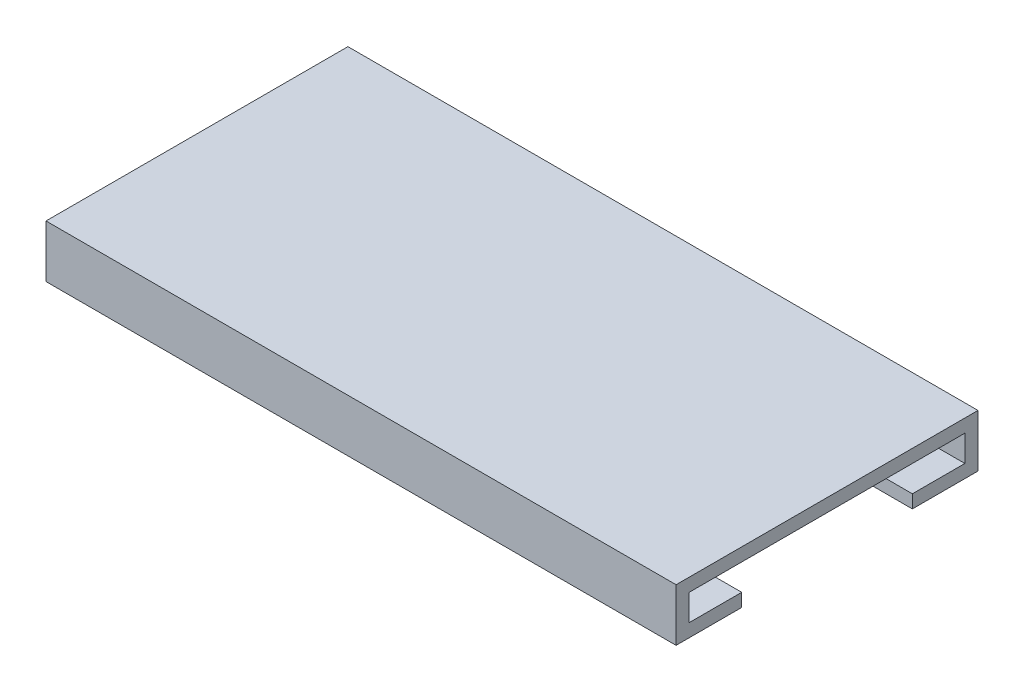
ISO-10303-21;
HEADER;
FILE_DESCRIPTION(('STEP AP214'),'2;1');
FILE_NAME('part.step','',(''),(''),'','','');
FILE_SCHEMA(('AUTOMOTIVE_DESIGN { 1 0 10303 214 1 1 1 1 }'));
ENDSEC;
DATA;
#1=APPLICATION_CONTEXT('core data for automotive mechanical design processes');
#2=APPLICATION_PROTOCOL_DEFINITION('international standard','automotive_design',2000,#1);
#3=PRODUCT_CONTEXT('',#1,'mechanical');
#4=PRODUCT('Part','Part','',(#3));
#5=PRODUCT_RELATED_PRODUCT_CATEGORY('part','',(#4));
#6=PRODUCT_DEFINITION_FORMATION('','',#4);
#7=PRODUCT_DEFINITION_CONTEXT('part definition',#1,'design');
#8=PRODUCT_DEFINITION('design','',#6,#7);
#9=PRODUCT_DEFINITION_SHAPE('','',#8);
#10=(LENGTH_UNIT() NAMED_UNIT(*) SI_UNIT(.MILLI.,.METRE.));
#11=(NAMED_UNIT(*) PLANE_ANGLE_UNIT() SI_UNIT($,.RADIAN.));
#12=(NAMED_UNIT(*) SI_UNIT($,.STERADIAN.) SOLID_ANGLE_UNIT());
#13=UNCERTAINTY_MEASURE_WITH_UNIT(LENGTH_MEASURE(1.E-05),#10,'distance_accuracy_value','');
#14=(GEOMETRIC_REPRESENTATION_CONTEXT(3) GLOBAL_UNCERTAINTY_ASSIGNED_CONTEXT((#13)) GLOBAL_UNIT_ASSIGNED_CONTEXT((#10,
#11,#12)) REPRESENTATION_CONTEXT('',''));
#15=CARTESIAN_POINT('',(0.,0.,0.));
#16=DIRECTION('',(0.,0.,1.));
#17=DIRECTION('',(1.,0.,0.));
#18=AXIS2_PLACEMENT_3D('',#15,#16,#17);
#19=CARTESIAN_POINT('',(76.2,-3.175,-18.25625));
#20=DIRECTION('',(0.,0.,1.));
#21=DIRECTION('',(1.,0.,0.));
#22=AXIS2_PLACEMENT_3D('',#19,#20,#21);
#23=PLANE('',#22);
#24=DIRECTION('',(0.,1.,0.));
#25=VECTOR('',#24,1.);
#26=CARTESIAN_POINT('',(0.,-3.175,-18.25625));
#27=LINE('',#26,#25);
#28=CARTESIAN_POINT('',(0.,-3.175,-18.25625));
#29=VERTEX_POINT('',#28);
#30=CARTESIAN_POINT('',(0.,3.175,-18.25625));
#31=VERTEX_POINT('',#30);
#32=EDGE_CURVE('E162',#29,#31,#27,.T.);
#33=ORIENTED_EDGE('',*,*,#32,.T.);
#34=DIRECTION('',(-1.,0.,0.));
#35=VECTOR('',#34,1.);
#36=CARTESIAN_POINT('',(76.2,3.175,-18.25625));
#37=LINE('',#36,#35);
#38=CARTESIAN_POINT('',(76.2,3.175,-18.25625));
#39=VERTEX_POINT('',#38);
#40=EDGE_CURVE('E11',#39,#31,#37,.T.);
#41=ORIENTED_EDGE('',*,*,#40,.F.);
#42=DIRECTION('',(0.,1.,0.));
#43=VECTOR('',#42,1.);
#44=CARTESIAN_POINT('',(76.2,-3.175,-18.25625));
#45=LINE('',#44,#43);
#46=CARTESIAN_POINT('',(76.2,-3.175,-18.25625));
#47=VERTEX_POINT('',#46);
#48=EDGE_CURVE('E184',#47,#39,#45,.T.);
#49=ORIENTED_EDGE('',*,*,#48,.F.);
#50=DIRECTION('',(-1.,0.,0.));
#51=VECTOR('',#50,1.);
#52=CARTESIAN_POINT('',(76.2,-3.175,-18.25625));
#53=LINE('',#52,#51);
#54=EDGE_CURVE('E158',#47,#29,#53,.T.);
#55=ORIENTED_EDGE('',*,*,#54,.T.);
#56=EDGE_LOOP('',(#33,#41,#49,#55));
#57=FACE_BOUND('',#56,.T.);
#58=ADVANCED_FACE('F42',(#57),#23,.F.);
#59=CARTESIAN_POINT('',(76.2,3.175,18.25625));
#60=DIRECTION('',(0.,-1.,0.));
#61=DIRECTION('',(0.,0.,-1.));
#62=AXIS2_PLACEMENT_3D('',#59,#60,#61);
#63=PLANE('',#62);
#64=DIRECTION('',(0.,0.,1.));
#65=VECTOR('',#64,1.);
#66=CARTESIAN_POINT('',(0.,3.175,18.25625));
#67=LINE('',#66,#65);
#68=CARTESIAN_POINT('',(0.,3.175,18.25625));
#69=VERTEX_POINT('',#68);
#70=EDGE_CURVE('E165',#31,#69,#67,.T.);
#71=ORIENTED_EDGE('',*,*,#70,.T.);
#72=DIRECTION('',(-1.,0.,0.));
#73=VECTOR('',#72,1.);
#74=CARTESIAN_POINT('',(76.2,3.175,18.25625));
#75=LINE('',#74,#73);
#76=CARTESIAN_POINT('',(76.2,3.175,18.25625));
#77=VERTEX_POINT('',#76);
#78=EDGE_CURVE('E50',#77,#69,#75,.T.);
#79=ORIENTED_EDGE('',*,*,#78,.F.);
#80=DIRECTION('',(0.,0.,1.));
#81=VECTOR('',#80,1.);
#82=CARTESIAN_POINT('',(76.2,3.175,18.25625));
#83=LINE('',#82,#81);
#84=EDGE_CURVE('E113',#39,#77,#83,.T.);
#85=ORIENTED_EDGE('',*,*,#84,.F.);
#86=ORIENTED_EDGE('',*,*,#40,.T.);
#87=EDGE_LOOP('',(#71,#79,#85,#86));
#88=FACE_BOUND('',#87,.T.);
#89=ADVANCED_FACE('F262',(#88),#63,.F.);
#90=CARTESIAN_POINT('',(76.2,-3.175,18.25625));
#91=DIRECTION('',(0.,0.,-1.));
#92=DIRECTION('',(-1.,0.,0.));
#93=AXIS2_PLACEMENT_3D('',#90,#91,#92);
#94=PLANE('',#93);
#95=DIRECTION('',(0.,-1.,0.));
#96=VECTOR('',#95,1.);
#97=CARTESIAN_POINT('',(0.,-3.175,18.25625));
#98=LINE('',#97,#96);
#99=CARTESIAN_POINT('',(0.,-3.175,18.25625));
#100=VERTEX_POINT('',#99);
#101=EDGE_CURVE('E167',#69,#100,#98,.T.);
#102=ORIENTED_EDGE('',*,*,#101,.T.);
#103=DIRECTION('',(-1.,0.,0.));
#104=VECTOR('',#103,1.);
#105=CARTESIAN_POINT('',(76.2,-3.175,18.25625));
#106=LINE('',#105,#104);
#107=CARTESIAN_POINT('',(76.2,-3.175,18.25625));
#108=VERTEX_POINT('',#107);
#109=EDGE_CURVE('E203',#108,#100,#106,.T.);
#110=ORIENTED_EDGE('',*,*,#109,.F.);
#111=DIRECTION('',(0.,-1.,0.));
#112=VECTOR('',#111,1.);
#113=CARTESIAN_POINT('',(76.2,-3.175,18.25625));
#114=LINE('',#113,#112);
#115=EDGE_CURVE('E211',#77,#108,#114,.T.);
#116=ORIENTED_EDGE('',*,*,#115,.F.);
#117=ORIENTED_EDGE('',*,*,#78,.T.);
#118=EDGE_LOOP('',(#102,#110,#116,#117));
#119=FACE_BOUND('',#118,.T.);
#120=ADVANCED_FACE('F209',(#119),#94,.F.);
#121=CARTESIAN_POINT('',(76.2,-3.175,18.25625));
#122=DIRECTION('',(0.,1.,0.));
#123=DIRECTION('',(0.,0.,1.));
#124=AXIS2_PLACEMENT_3D('',#121,#122,#123);
#125=PLANE('',#124);
#126=DIRECTION('',(0.,0.,-1.));
#127=VECTOR('',#126,1.);
#128=CARTESIAN_POINT('',(0.,-3.175,18.25625));
#129=LINE('',#128,#127);
#130=CARTESIAN_POINT('',(0.,-3.175,10.31875));
#131=VERTEX_POINT('',#130);
#132=EDGE_CURVE('E169',#100,#131,#129,.T.);
#133=ORIENTED_EDGE('',*,*,#132,.T.);
#134=DIRECTION('',(-1.,0.,0.));
#135=VECTOR('',#134,1.);
#136=CARTESIAN_POINT('',(76.2,-3.175,10.31875));
#137=LINE('',#136,#135);
#138=CARTESIAN_POINT('',(76.2,-3.175,10.31875));
#139=VERTEX_POINT('',#138);
#140=EDGE_CURVE('E200',#139,#131,#137,.T.);
#141=ORIENTED_EDGE('',*,*,#140,.F.);
#142=DIRECTION('',(0.,0.,-1.));
#143=VECTOR('',#142,1.);
#144=CARTESIAN_POINT('',(76.2,-3.175,18.25625));
#145=LINE('',#144,#143);
#146=EDGE_CURVE('E229',#108,#139,#145,.T.);
#147=ORIENTED_EDGE('',*,*,#146,.F.);
#148=ORIENTED_EDGE('',*,*,#109,.T.);
#149=EDGE_LOOP('',(#133,#141,#147,#148));
#150=FACE_BOUND('',#149,.T.);
#151=ADVANCED_FACE('F220',(#150),#125,.F.);
#152=CARTESIAN_POINT('',(76.2,-3.175,10.31875));
#153=DIRECTION('',(0.,0.,1.));
#154=DIRECTION('',(1.,0.,0.));
#155=AXIS2_PLACEMENT_3D('',#152,#153,#154);
#156=PLANE('',#155);
#157=DIRECTION('',(0.,1.,0.));
#158=VECTOR('',#157,1.);
#159=CARTESIAN_POINT('',(0.,-3.175,10.31875));
#160=LINE('',#159,#158);
#161=CARTESIAN_POINT('',(0.,-1.5875,10.31875));
#162=VERTEX_POINT('',#161);
#163=EDGE_CURVE('E171',#131,#162,#160,.T.);
#164=ORIENTED_EDGE('',*,*,#163,.T.);
#165=DIRECTION('',(-1.,0.,0.));
#166=VECTOR('',#165,1.);
#167=CARTESIAN_POINT('',(76.2,-1.5875,10.31875));
#168=LINE('',#167,#166);
#169=CARTESIAN_POINT('',(76.2,-1.5875,10.31875));
#170=VERTEX_POINT('',#169);
#171=EDGE_CURVE('E197',#170,#162,#168,.T.);
#172=ORIENTED_EDGE('',*,*,#171,.F.);
#173=DIRECTION('',(0.,1.,0.));
#174=VECTOR('',#173,1.);
#175=CARTESIAN_POINT('',(76.2,-3.175,10.31875));
#176=LINE('',#175,#174);
#177=EDGE_CURVE('E226',#139,#170,#176,.T.);
#178=ORIENTED_EDGE('',*,*,#177,.F.);
#179=ORIENTED_EDGE('',*,*,#140,.T.);
#180=EDGE_LOOP('',(#164,#172,#178,#179));
#181=FACE_BOUND('',#180,.T.);
#182=ADVANCED_FACE('F224',(#181),#156,.F.);
#183=CARTESIAN_POINT('',(76.2,-1.5875,10.31875));
#184=DIRECTION('',(0.,-1.,0.));
#185=DIRECTION('',(0.,0.,-1.));
#186=AXIS2_PLACEMENT_3D('',#183,#184,#185);
#187=PLANE('',#186);
#188=DIRECTION('',(0.,0.,1.));
#189=VECTOR('',#188,1.);
#190=CARTESIAN_POINT('',(0.,-1.5875,10.31875));
#191=LINE('',#190,#189);
#192=CARTESIAN_POINT('',(0.,-1.5875,16.66875));
#193=VERTEX_POINT('',#192);
#194=EDGE_CURVE('E173',#162,#193,#191,.T.);
#195=ORIENTED_EDGE('',*,*,#194,.T.);
#196=DIRECTION('',(-1.,0.,0.));
#197=VECTOR('',#196,1.);
#198=CARTESIAN_POINT('',(76.2,-1.5875,16.66875));
#199=LINE('',#198,#197);
#200=CARTESIAN_POINT('',(76.2,-1.5875,16.66875));
#201=VERTEX_POINT('',#200);
#202=EDGE_CURVE('E194',#201,#193,#199,.T.);
#203=ORIENTED_EDGE('',*,*,#202,.F.);
#204=DIRECTION('',(0.,0.,1.));
#205=VECTOR('',#204,1.);
#206=CARTESIAN_POINT('',(76.2,-1.5875,10.31875));
#207=LINE('',#206,#205);
#208=EDGE_CURVE('E228',#170,#201,#207,.T.);
#209=ORIENTED_EDGE('',*,*,#208,.F.);
#210=ORIENTED_EDGE('',*,*,#171,.T.);
#211=EDGE_LOOP('',(#195,#203,#209,#210));
#212=FACE_BOUND('',#211,.T.);
#213=ADVANCED_FACE('F275',(#212),#187,.F.);
#214=CARTESIAN_POINT('',(76.2,-1.5875,16.66875));
#215=DIRECTION('',(0.,0.,1.));
#216=DIRECTION('',(1.,0.,0.));
#217=AXIS2_PLACEMENT_3D('',#214,#215,#216);
#218=PLANE('',#217);
#219=DIRECTION('',(0.,1.,0.));
#220=VECTOR('',#219,1.);
#221=CARTESIAN_POINT('',(0.,-1.5875,16.66875));
#222=LINE('',#221,#220);
#223=CARTESIAN_POINT('',(0.,1.5875,16.66875));
#224=VERTEX_POINT('',#223);
#225=EDGE_CURVE('E175',#193,#224,#222,.T.);
#226=ORIENTED_EDGE('',*,*,#225,.T.);
#227=DIRECTION('',(-1.,0.,0.));
#228=VECTOR('',#227,1.);
#229=CARTESIAN_POINT('',(76.2,1.5875,16.66875));
#230=LINE('',#229,#228);
#231=CARTESIAN_POINT('',(76.2,1.5875,16.66875));
#232=VERTEX_POINT('',#231);
#233=EDGE_CURVE('E191',#232,#224,#230,.T.);
#234=ORIENTED_EDGE('',*,*,#233,.F.);
#235=DIRECTION('',(0.,1.,0.));
#236=VECTOR('',#235,1.);
#237=CARTESIAN_POINT('',(76.2,-1.5875,16.66875));
#238=LINE('',#237,#236);
#239=EDGE_CURVE('E231',#201,#232,#238,.T.);
#240=ORIENTED_EDGE('',*,*,#239,.F.);
#241=ORIENTED_EDGE('',*,*,#202,.T.);
#242=EDGE_LOOP('',(#226,#234,#240,#241));
#243=FACE_BOUND('',#242,.T.);
#244=ADVANCED_FACE('F278',(#243),#218,.F.);
#245=CARTESIAN_POINT('',(76.2,1.5875,16.66875));
#246=DIRECTION('',(0.,1.,0.));
#247=DIRECTION('',(0.,0.,1.));
#248=AXIS2_PLACEMENT_3D('',#245,#246,#247);
#249=PLANE('',#248);
#250=DIRECTION('',(0.,0.,-1.));
#251=VECTOR('',#250,1.);
#252=CARTESIAN_POINT('',(0.,1.5875,16.66875));
#253=LINE('',#252,#251);
#254=CARTESIAN_POINT('',(0.,1.5875,-16.66875));
#255=VERTEX_POINT('',#254);
#256=EDGE_CURVE('E177',#224,#255,#253,.T.);
#257=ORIENTED_EDGE('',*,*,#256,.T.);
#258=DIRECTION('',(-1.,0.,0.));
#259=VECTOR('',#258,1.);
#260=CARTESIAN_POINT('',(76.2,1.5875,-16.66875));
#261=LINE('',#260,#259);
#262=CARTESIAN_POINT('',(76.2,1.5875,-16.66875));
#263=VERTEX_POINT('',#262);
#264=EDGE_CURVE('E188',#263,#255,#261,.T.);
#265=ORIENTED_EDGE('',*,*,#264,.F.);
#266=DIRECTION('',(0.,0.,-1.));
#267=VECTOR('',#266,1.);
#268=CARTESIAN_POINT('',(76.2,1.5875,16.66875));
#269=LINE('',#268,#267);
#270=EDGE_CURVE('E237',#232,#263,#269,.T.);
#271=ORIENTED_EDGE('',*,*,#270,.F.);
#272=ORIENTED_EDGE('',*,*,#233,.T.);
#273=EDGE_LOOP('',(#257,#265,#271,#272));
#274=FACE_BOUND('',#273,.T.);
#275=ADVANCED_FACE('F243',(#274),#249,.F.);
#276=CARTESIAN_POINT('',(76.2,-1.5875,-16.66875));
#277=DIRECTION('',(0.,0.,-1.));
#278=DIRECTION('',(-1.,0.,0.));
#279=AXIS2_PLACEMENT_3D('',#276,#277,#278);
#280=PLANE('',#279);
#281=DIRECTION('',(0.,-1.,0.));
#282=VECTOR('',#281,1.);
#283=CARTESIAN_POINT('',(0.,-1.5875,-16.66875));
#284=LINE('',#283,#282);
#285=CARTESIAN_POINT('',(0.,-1.5875,-16.66875));
#286=VERTEX_POINT('',#285);
#287=EDGE_CURVE('E179',#255,#286,#284,.T.);
#288=ORIENTED_EDGE('',*,*,#287,.T.);
#289=DIRECTION('',(-1.,0.,0.));
#290=VECTOR('',#289,1.);
#291=CARTESIAN_POINT('',(76.2,-1.5875,-16.66875));
#292=LINE('',#291,#290);
#293=CARTESIAN_POINT('',(76.2,-1.5875,-16.66875));
#294=VERTEX_POINT('',#293);
#295=EDGE_CURVE('E153',#294,#286,#292,.T.);
#296=ORIENTED_EDGE('',*,*,#295,.F.);
#297=DIRECTION('',(0.,-1.,0.));
#298=VECTOR('',#297,1.);
#299=CARTESIAN_POINT('',(76.2,-1.5875,-16.66875));
#300=LINE('',#299,#298);
#301=EDGE_CURVE('E144',#263,#294,#300,.T.);
#302=ORIENTED_EDGE('',*,*,#301,.F.);
#303=ORIENTED_EDGE('',*,*,#264,.T.);
#304=EDGE_LOOP('',(#288,#296,#302,#303));
#305=FACE_BOUND('',#304,.T.);
#306=ADVANCED_FACE('F247',(#305),#280,.F.);
#307=CARTESIAN_POINT('',(76.2,-1.5875,-10.31875));
#308=DIRECTION('',(0.,-1.,0.));
#309=DIRECTION('',(0.,0.,-1.));
#310=AXIS2_PLACEMENT_3D('',#307,#308,#309);
#311=PLANE('',#310);
#312=DIRECTION('',(0.,0.,1.));
#313=VECTOR('',#312,1.);
#314=CARTESIAN_POINT('',(0.,-1.5875,-10.31875));
#315=LINE('',#314,#313);
#316=CARTESIAN_POINT('',(0.,-1.5875,-10.31875));
#317=VERTEX_POINT('',#316);
#318=EDGE_CURVE('E152',#286,#317,#315,.T.);
#319=ORIENTED_EDGE('',*,*,#318,.T.);
#320=DIRECTION('',(-1.,0.,0.));
#321=VECTOR('',#320,1.);
#322=CARTESIAN_POINT('',(76.2,-1.5875,-10.31875));
#323=LINE('',#322,#321);
#324=CARTESIAN_POINT('',(76.2,-1.5875,-10.31875));
#325=VERTEX_POINT('',#324);
#326=EDGE_CURVE('E149',#325,#317,#323,.T.);
#327=ORIENTED_EDGE('',*,*,#326,.F.);
#328=DIRECTION('',(0.,0.,1.));
#329=VECTOR('',#328,1.);
#330=CARTESIAN_POINT('',(76.2,-1.5875,-10.31875));
#331=LINE('',#330,#329);
#332=EDGE_CURVE('E138',#294,#325,#331,.T.);
#333=ORIENTED_EDGE('',*,*,#332,.F.);
#334=ORIENTED_EDGE('',*,*,#295,.T.);
#335=EDGE_LOOP('',(#319,#327,#333,#334));
#336=FACE_BOUND('',#335,.T.);
#337=ADVANCED_FACE('F150',(#336),#311,.F.);
#338=CARTESIAN_POINT('',(76.2,-3.175,-10.31875));
#339=DIRECTION('',(0.,0.,-1.));
#340=DIRECTION('',(-1.,0.,0.));
#341=AXIS2_PLACEMENT_3D('',#338,#339,#340);
#342=PLANE('',#341);
#343=DIRECTION('',(0.,-1.,0.));
#344=VECTOR('',#343,1.);
#345=CARTESIAN_POINT('',(0.,-3.175,-10.31875));
#346=LINE('',#345,#344);
#347=CARTESIAN_POINT('',(0.,-3.175,-10.31875));
#348=VERTEX_POINT('',#347);
#349=EDGE_CURVE('E99',#317,#348,#346,.T.);
#350=ORIENTED_EDGE('',*,*,#349,.T.);
#351=DIRECTION('',(-1.,0.,0.));
#352=VECTOR('',#351,1.);
#353=CARTESIAN_POINT('',(76.2,-3.175,-10.31875));
#354=LINE('',#353,#352);
#355=CARTESIAN_POINT('',(76.2,-3.175,-10.31875));
#356=VERTEX_POINT('',#355);
#357=EDGE_CURVE('E154',#356,#348,#354,.T.);
#358=ORIENTED_EDGE('',*,*,#357,.F.);
#359=DIRECTION('',(0.,-1.,0.));
#360=VECTOR('',#359,1.);
#361=CARTESIAN_POINT('',(76.2,-3.175,-10.31875));
#362=LINE('',#361,#360);
#363=EDGE_CURVE('E142',#325,#356,#362,.T.);
#364=ORIENTED_EDGE('',*,*,#363,.F.);
#365=ORIENTED_EDGE('',*,*,#326,.T.);
#366=EDGE_LOOP('',(#350,#358,#364,#365));
#367=FACE_BOUND('',#366,.T.);
#368=ADVANCED_FACE('F156',(#367),#342,.F.);
#369=CARTESIAN_POINT('',(76.2,-3.175,-10.31875));
#370=DIRECTION('',(0.,1.,0.));
#371=DIRECTION('',(0.,0.,1.));
#372=AXIS2_PLACEMENT_3D('',#369,#370,#371);
#373=PLANE('',#372);
#374=DIRECTION('',(0.,0.,-1.));
#375=VECTOR('',#374,1.);
#376=CARTESIAN_POINT('',(0.,-3.175,-10.31875));
#377=LINE('',#376,#375);
#378=EDGE_CURVE('E105',#348,#29,#377,.T.);
#379=ORIENTED_EDGE('',*,*,#378,.T.);
#380=ORIENTED_EDGE('',*,*,#54,.F.);
#381=DIRECTION('',(0.,0.,-1.));
#382=VECTOR('',#381,1.);
#383=CARTESIAN_POINT('',(76.2,-3.175,-10.31875));
#384=LINE('',#383,#382);
#385=EDGE_CURVE('E58',#356,#47,#384,.T.);
#386=ORIENTED_EDGE('',*,*,#385,.F.);
#387=ORIENTED_EDGE('',*,*,#357,.T.);
#388=EDGE_LOOP('',(#379,#380,#386,#387));
#389=FACE_BOUND('',#388,.T.);
#390=ADVANCED_FACE('F251',(#389),#373,.F.);
#391=CARTESIAN_POINT('',(76.2,0.,0.));
#392=DIRECTION('',(-1.,0.,0.));
#393=DIRECTION('',(0.,0.,1.));
#394=AXIS2_PLACEMENT_3D('',#391,#392,#393);
#395=PLANE('',#394);
#396=ORIENTED_EDGE('',*,*,#48,.T.);
#397=ORIENTED_EDGE('',*,*,#84,.T.);
#398=ORIENTED_EDGE('',*,*,#115,.T.);
#399=ORIENTED_EDGE('',*,*,#146,.T.);
#400=ORIENTED_EDGE('',*,*,#177,.T.);
#401=ORIENTED_EDGE('',*,*,#208,.T.);
#402=ORIENTED_EDGE('',*,*,#239,.T.);
#403=ORIENTED_EDGE('',*,*,#270,.T.);
#404=ORIENTED_EDGE('',*,*,#301,.T.);
#405=ORIENTED_EDGE('',*,*,#332,.T.);
#406=ORIENTED_EDGE('',*,*,#363,.T.);
#407=ORIENTED_EDGE('',*,*,#385,.T.);
#408=EDGE_LOOP('',(#396,#397,#398,#399,#400,#401,#402,#403,#404,#405,#406,#407));
#409=FACE_BOUND('',#408,.T.);
#410=ADVANCED_FACE('F140',(#409),#395,.F.);
#411=CARTESIAN_POINT('',(0.,0.,0.));
#412=DIRECTION('',(-1.,0.,0.));
#413=DIRECTION('',(0.,0.,1.));
#414=AXIS2_PLACEMENT_3D('',#411,#412,#413);
#415=PLANE('',#414);
#416=ORIENTED_EDGE('',*,*,#32,.F.);
#417=ORIENTED_EDGE('',*,*,#378,.F.);
#418=ORIENTED_EDGE('',*,*,#349,.F.);
#419=ORIENTED_EDGE('',*,*,#318,.F.);
#420=ORIENTED_EDGE('',*,*,#287,.F.);
#421=ORIENTED_EDGE('',*,*,#256,.F.);
#422=ORIENTED_EDGE('',*,*,#225,.F.);
#423=ORIENTED_EDGE('',*,*,#194,.F.);
#424=ORIENTED_EDGE('',*,*,#163,.F.);
#425=ORIENTED_EDGE('',*,*,#132,.F.);
#426=ORIENTED_EDGE('',*,*,#101,.F.);
#427=ORIENTED_EDGE('',*,*,#70,.F.);
#428=EDGE_LOOP('',(#416,#417,#418,#419,#420,#421,#422,#423,#424,#425,#426,#427));
#429=FACE_BOUND('',#428,.T.);
#430=ADVANCED_FACE('F215',(#429),#415,.T.);
#431=CLOSED_SHELL('',(#58,#89,#120,#151,#182,#213,#244,#275,#306,#337,#368,#390,#410,#430));
#432=MANIFOLD_SOLID_BREP('B2',#431);
#433=ADVANCED_BREP_SHAPE_REPRESENTATION('',(#18,#432),#14);
#434=SHAPE_DEFINITION_REPRESENTATION(#9,#433);
ENDSEC;
END-ISO-10303-21;
